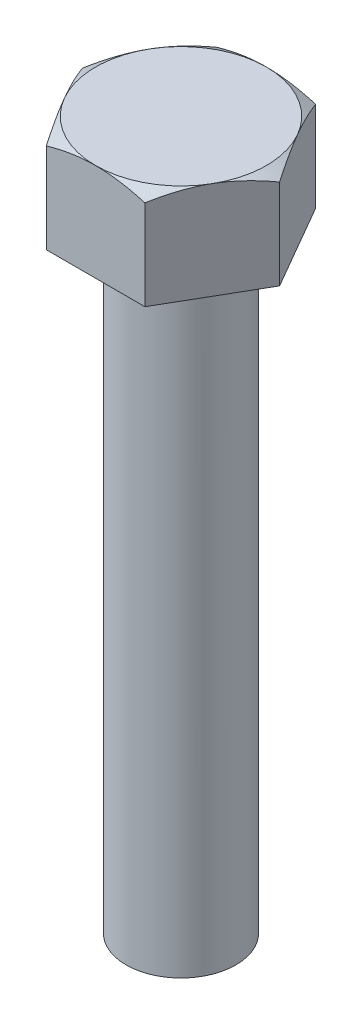
ISO-10303-21;
HEADER;
FILE_DESCRIPTION(('STEP AP214'),'2;1');
FILE_NAME('part.step','',(''),(''),'','','');
FILE_SCHEMA(('AUTOMOTIVE_DESIGN { 1 0 10303 214 1 1 1 1 }'));
ENDSEC;
DATA;
#1=APPLICATION_CONTEXT('core data for automotive mechanical design processes');
#2=APPLICATION_PROTOCOL_DEFINITION('international standard','automotive_design',2000,#1);
#3=PRODUCT_CONTEXT('',#1,'mechanical');
#4=PRODUCT('Part','Part','',(#3));
#5=PRODUCT_RELATED_PRODUCT_CATEGORY('part','',(#4));
#6=PRODUCT_DEFINITION_FORMATION('','',#4);
#7=PRODUCT_DEFINITION_CONTEXT('part definition',#1,'design');
#8=PRODUCT_DEFINITION('design','',#6,#7);
#9=PRODUCT_DEFINITION_SHAPE('','',#8);
#10=(LENGTH_UNIT() NAMED_UNIT(*) SI_UNIT(.MILLI.,.METRE.));
#11=(NAMED_UNIT(*) PLANE_ANGLE_UNIT() SI_UNIT($,.RADIAN.));
#12=(NAMED_UNIT(*) SI_UNIT($,.STERADIAN.) SOLID_ANGLE_UNIT());
#13=UNCERTAINTY_MEASURE_WITH_UNIT(LENGTH_MEASURE(1.E-05),#10,'distance_accuracy_value','');
#14=(GEOMETRIC_REPRESENTATION_CONTEXT(3) GLOBAL_UNCERTAINTY_ASSIGNED_CONTEXT((#13)) GLOBAL_UNIT_ASSIGNED_CONTEXT((#10,
#11,#12)) REPRESENTATION_CONTEXT('',''));
#15=CARTESIAN_POINT('',(0.,0.,0.));
#16=DIRECTION('',(0.,0.,1.));
#17=DIRECTION('',(1.,0.,0.));
#18=AXIS2_PLACEMENT_3D('',#15,#16,#17);
#19=CARTESIAN_POINT('',(2.02072594216373,-4.,3.49999999999998));
#20=DIRECTION('',(0.866025403784441,0.,0.499999999999995));
#21=DIRECTION('',(0.499999999999995,0.,-0.866025403784442));
#22=AXIS2_PLACEMENT_3D('',#19,#20,#21);
#23=PLANE('',#22);
#24=DIRECTION('',(0.,1.,0.));
#25=VECTOR('',#24,1.);
#26=CARTESIAN_POINT('',(4.04145188432738,-4.,0.));
#27=LINE('',#26,#25);
#28=CARTESIAN_POINT('',(4.04145188432738,-4.,0.));
#29=VERTEX_POINT('',#28);
#30=CARTESIAN_POINT('',(4.04145188432738,-0.312607391169643,0.));
#31=VERTEX_POINT('',#30);
#32=EDGE_CURVE('E142',#29,#31,#27,.T.);
#33=ORIENTED_EDGE('',*,*,#32,.T.);
#34=CARTESIAN_POINT('',(4.04156735438122,-0.312674060693368,-0.00020000000000009));
#35=CARTESIAN_POINT('',(3.9527667384984,-0.261385788989982,0.15360717845245));
#36=CARTESIAN_POINT('',(3.86319960126198,-0.214740953816197,0.308742010834425));
#37=CARTESIAN_POINT('',(3.68251437287563,-0.133321875533351,0.621698006576784));
#38=CARTESIAN_POINT('',(3.59139307116726,-0.0985764355845646,0.779524730787499));
#39=CARTESIAN_POINT('',(3.41027974688035,-0.0444900271828409,1.09322221038013));
#40=CARTESIAN_POINT('',(3.32031559103709,-0.024789086260387,1.2490446991607));
#41=CARTESIAN_POINT('',(3.13996396008053,-0.00127013273726128,1.56142288720538));
#42=CARTESIAN_POINT('',(3.04957714051107,0.00256735545442698,1.71797745103424));
#43=CARTESIAN_POINT('',(2.88068384499779,-0.00541530187698655,2.01050921992099));
#44=CARTESIAN_POINT('',(2.80215208834116,-0.015275434069616,2.14653021245791));
#45=CARTESIAN_POINT('',(2.64560020969756,-0.0465264668994118,2.41768602028899));
#46=CARTESIAN_POINT('',(2.56758062920652,-0.0679280432858057,2.55281989768468));
#47=CARTESIAN_POINT('',(2.41070596159681,-0.121430407880583,2.82453479240517));
#48=CARTESIAN_POINT('',(2.33187072981467,-0.153757994445091,2.96108141927832));
#49=CARTESIAN_POINT('',(2.17537608630787,-0.227128933807996,3.23213809294449));
#50=CARTESIAN_POINT('',(2.09771466960102,-0.268155046569867,3.36665161246852));
#51=CARTESIAN_POINT('',(2.02061047210989,-0.312674060693369,3.50019999999998));
#52=B_SPLINE_CURVE_WITH_KNOTS('',3,(#34,#35,#36,#37,#38,#39,#40,#41,#42,#43,#44,#45,#46,#47,#48,
#49,#50,#51),.UNSPECIFIED.,.F.,.F.,(4,2,2,2,2,2,2,2,4),(0.,0.554793832886253,1.11092123814984,
1.65328467083219,2.19498204478403,2.66665130850859,3.13875761298265,3.62133612600506,
4.10296698719183),.UNSPECIFIED.);
#53=CARTESIAN_POINT('',(3.03108891324554,0.,1.74999999999998));
#54=VERTEX_POINT('',#53);
#55=EDGE_CURVE('E55',#31,#54,#52,.T.);
#56=ORIENTED_EDGE('',*,*,#55,.T.);
#57=CARTESIAN_POINT('',(2.02072594216373,-0.312607391169642,3.49999999999998));
#58=VERTEX_POINT('',#57);
#59=EDGE_CURVE('E169',#54,#58,#52,.T.);
#60=ORIENTED_EDGE('',*,*,#59,.T.);
#61=DIRECTION('',(0.,1.,0.));
#62=VECTOR('',#61,1.);
#63=CARTESIAN_POINT('',(2.02072594216373,-4.,3.49999999999998));
#64=LINE('',#63,#62);
#65=CARTESIAN_POINT('',(2.02072594216373,-4.,3.49999999999998));
#66=VERTEX_POINT('',#65);
#67=EDGE_CURVE('E133',#66,#58,#64,.T.);
#68=ORIENTED_EDGE('',*,*,#67,.F.);
#69=DIRECTION('',(0.499999999999995,0.,-0.866025403784441));
#70=VECTOR('',#69,1.);
#71=CARTESIAN_POINT('',(2.02072594216373,-4.,3.49999999999998));
#72=LINE('',#71,#70);
#73=EDGE_CURVE('E166',#66,#29,#72,.T.);
#74=ORIENTED_EDGE('',*,*,#73,.T.);
#75=EDGE_LOOP('',(#33,#56,#60,#68,#74));
#76=FACE_BOUND('',#75,.T.);
#77=ADVANCED_FACE('F33',(#76),#23,.T.);
#78=CARTESIAN_POINT('',(-2.02072594216366,-4.,3.50000000000002));
#79=DIRECTION('',(0.,0.,1.));
#80=DIRECTION('',(1.,0.,0.));
#81=AXIS2_PLACEMENT_3D('',#78,#79,#80);
#82=PLANE('',#81);
#83=ORIENTED_EDGE('',*,*,#67,.T.);
#84=CARTESIAN_POINT('',(-5.35926424048619,-1.6748440724779,3.50000000000006));
#85=CARTESIAN_POINT('',(-5.20559440559572,-1.60058231497446,3.50000000000006));
#86=CARTESIAN_POINT('',(-5.05156124454355,-1.52705878056118,3.50000000000005));
#87=CARTESIAN_POINT('',(-4.74257181977879,-1.38191000416732,3.50000000000005));
#88=CARTESIAN_POINT('',(-4.58761540185543,-1.31028509085496,3.50000000000005));
#89=CARTESIAN_POINT('',(-4.27574595068721,-1.16897807882458,3.50000000000004));
#90=CARTESIAN_POINT('',(-4.11882679505205,-1.09930944363486,3.50000000000004));
#91=CARTESIAN_POINT('',(-3.80369874616061,-0.962964609282971,3.50000000000004));
#92=CARTESIAN_POINT('',(-3.64548992064161,-0.89628825413883,3.50000000000004));
#93=CARTESIAN_POINT('',(-3.3255668679968,-0.76593209090634,3.50000000000004));
#94=CARTESIAN_POINT('',(-3.1638334509989,-0.702299120726497,3.50000000000003));
#95=CARTESIAN_POINT('',(-2.83845895714225,-0.580016900953805,3.50000000000003));
#96=CARTESIAN_POINT('',(-2.67481767033953,-0.521368205835811,3.50000000000003));
#97=CARTESIAN_POINT('',(-2.345703193734,-0.410630410873415,3.50000000000002));
#98=CARTESIAN_POINT('',(-2.18023474470134,-0.358527365355124,3.50000000000002));
#99=CARTESIAN_POINT('',(-1.84694549539018,-0.262573008307886,3.50000000000002));
#100=CARTESIAN_POINT('',(-1.67912545711471,-0.218719087285585,3.50000000000002));
#101=CARTESIAN_POINT('',(-1.34101838256743,-0.141391963972234,3.50000000000001));
#102=CARTESIAN_POINT('',(-1.17073070168116,-0.107921527224786,3.50000000000001));
#103=CARTESIAN_POINT('',(-0.828102254748845,-0.0536149371423592,3.50000000000001));
#104=CARTESIAN_POINT('',(-0.655761486889094,-0.0327787949694612,3.50000000000001));
#105=CARTESIAN_POINT('',(-0.311020130690008,-0.00558406591599681,3.5));
#106=CARTESIAN_POINT('',(-0.13862696061019,0.000866175296536139,3.5));
#107=CARTESIAN_POINT('',(0.206038662929289,-0.0010535759051767,3.5));
#108=CARTESIAN_POINT('',(0.378311136109308,-0.00941972129227985,3.5));
#109=CARTESIAN_POINT('',(0.672491314888679,-0.0357689751623791,3.49999999999999));
#110=CARTESIAN_POINT('',(0.794723571901849,-0.0503207336432905,3.49999999999999));
#111=CARTESIAN_POINT('',(1.0382438777124,-0.0859368690658899,3.49999999999999));
#112=CARTESIAN_POINT('',(1.15953177450315,-0.107002273117117,3.49999999999999));
#113=CARTESIAN_POINT('',(1.52188005346719,-0.178863395249661,3.49999999999998));
#114=CARTESIAN_POINT('',(1.7612419874188,-0.238305520994606,3.49999999999998));
#115=CARTESIAN_POINT('',(2.11941071826362,-0.340827114809809,3.49999999999998));
#116=CARTESIAN_POINT('',(2.24008446757478,-0.377750017969919,3.49999999999998));
#117=CARTESIAN_POINT('',(2.48017245637081,-0.455249363005883,3.49999999999997));
#118=CARTESIAN_POINT('',(2.5995875019874,-0.495823284914268,3.49999999999997));
#119=CARTESIAN_POINT('',(2.83665872785763,-0.57978039521915,3.49999999999997));
#120=CARTESIAN_POINT('',(2.95432102488646,-0.623146485712766,3.49999999999997));
#121=CARTESIAN_POINT('',(3.18873271700622,-0.712424019210119,3.49999999999997));
#122=CARTESIAN_POINT('',(3.3054817210672,-0.758336490959498,3.49999999999997));
#123=CARTESIAN_POINT('',(3.42180858719343,-0.805270873556988,3.49999999999996));
#124=B_SPLINE_CURVE_WITH_KNOTS('',3,(#84,#85,#86,#87,#88,#89,#90,#91,#92,#93,#94,#95,#96,#97,
#98,#99,#100,#101,#102,#103,#104,#105,#106,#107,#108,#109,#110,#111,#112,#113,#114,#115,#116,
#117,#118,#119,#120,#121,#122,#123),.UNSPECIFIED.,.F.,.F.,(4,2,2,2,2,2,2,2,2,2,2,2,2,2,2,2,2,2,
2,4),(0.,0.512025467708521,1.02413900028468,1.53918315265711,2.05420042547923,2.57554051253682,
3.09693852027603,3.61720612610814,4.13730887487718,4.65755002944064,5.17779164362336,
5.69470915048346,6.21149246105176,6.58059842964299,6.94976263071819,7.6886404599271,
8.06719870082304,8.44549763256366,8.82166724342673,9.19798995093339),.UNSPECIFIED.);
#125=CARTESIAN_POINT('',(0.,0.,3.5));
#126=VERTEX_POINT('',#125);
#127=EDGE_CURVE('E176',#58,#126,#124,.F.);
#128=ORIENTED_EDGE('',*,*,#127,.T.);
#129=CARTESIAN_POINT('',(-2.02072594216366,-0.312607391169643,3.50000000000002));
#130=VERTEX_POINT('',#129);
#131=EDGE_CURVE('E177',#126,#130,#124,.F.);
#132=ORIENTED_EDGE('',*,*,#131,.T.);
#133=DIRECTION('',(0.,1.,0.));
#134=VECTOR('',#133,1.);
#135=CARTESIAN_POINT('',(-2.02072594216366,-4.,3.50000000000002));
#136=LINE('',#135,#134);
#137=CARTESIAN_POINT('',(-2.02072594216366,-4.,3.50000000000002));
#138=VERTEX_POINT('',#137);
#139=EDGE_CURVE('E130',#138,#130,#136,.T.);
#140=ORIENTED_EDGE('',*,*,#139,.F.);
#141=DIRECTION('',(1.,0.,0.));
#142=VECTOR('',#141,1.);
#143=CARTESIAN_POINT('',(-2.02072594216366,-4.,3.50000000000002));
#144=LINE('',#143,#142);
#145=EDGE_CURVE('E144',#138,#66,#144,.T.);
#146=ORIENTED_EDGE('',*,*,#145,.T.);
#147=EDGE_LOOP('',(#83,#128,#132,#140,#146));
#148=FACE_BOUND('',#147,.T.);
#149=ADVANCED_FACE('F221',(#148),#82,.T.);
#150=CARTESIAN_POINT('',(-4.04145188432738,-4.,0.));
#151=DIRECTION('',(-0.866025403784435,0.,0.500000000000007));
#152=DIRECTION('',(0.500000000000007,0.,0.866025403784435));
#153=AXIS2_PLACEMENT_3D('',#150,#151,#152);
#154=PLANE('',#153);
#155=ORIENTED_EDGE('',*,*,#139,.T.);
#156=CARTESIAN_POINT('',(-2.02061047210982,-0.31267406069337,3.50020000000002));
#157=CARTESIAN_POINT('',(-2.10941108799264,-0.261385788989983,3.34639282154757));
#158=CARTESIAN_POINT('',(-2.19897822522906,-0.214740953816197,3.1912579891656));
#159=CARTESIAN_POINT('',(-2.37966345361542,-0.13332187553335,2.87830199342324));
#160=CARTESIAN_POINT('',(-2.4707847553238,-0.0985764355845626,2.72047526921253));
#161=CARTESIAN_POINT('',(-2.65189807961071,-0.0444900271828376,2.4067777896199));
#162=CARTESIAN_POINT('',(-2.74186223545397,-0.0247890862603831,2.25095530083934));
#163=CARTESIAN_POINT('',(-2.92221386641054,-0.00127013273725584,1.93857711279465));
#164=CARTESIAN_POINT('',(-3.01260068597999,0.00256735545443344,1.7820225489658));
#165=CARTESIAN_POINT('',(-3.18149398149328,-0.00541530187697886,1.48949078007904));
#166=CARTESIAN_POINT('',(-3.26002573814991,-0.0152754340696084,1.35346978754212));
#167=CARTESIAN_POINT('',(-3.41657761679353,-0.0465264668994046,1.08231397971104));
#168=CARTESIAN_POINT('',(-3.49459719728457,-0.067928043285799,0.947180102315347));
#169=CARTESIAN_POINT('',(-3.65147186489428,-0.121430407880578,0.675465207594846));
#170=CARTESIAN_POINT('',(-3.73030709667643,-0.153757994445087,0.538918580721694));
#171=CARTESIAN_POINT('',(-3.88680174018324,-0.227128933807994,0.267861907055527));
#172=CARTESIAN_POINT('',(-3.96446315689009,-0.268155046569867,0.133348387531492));
#173=CARTESIAN_POINT('',(-4.04156735438122,-0.312674060693371,-0.000199999999971952));
#174=B_SPLINE_CURVE_WITH_KNOTS('',3,(#156,#157,#158,#159,#160,#161,#162,#163,#164,#165,#166,
#167,#168,#169,#170,#171,#172,#173),.UNSPECIFIED.,.F.,.F.,(4,2,2,2,2,2,2,2,4),(0.,
0.554793832886254,1.11092123814984,1.65328467083219,2.19498204478403,2.6666513085086,
3.13875761298268,3.6213361260051,4.10296698719188),.UNSPECIFIED.);
#175=CARTESIAN_POINT('',(-3.03108891324552,0.,1.75000000000003));
#176=VERTEX_POINT('',#175);
#177=EDGE_CURVE('E124',#130,#176,#174,.T.);
#178=ORIENTED_EDGE('',*,*,#177,.T.);
#179=CARTESIAN_POINT('',(-4.04145188432738,-0.312607391169643,0.));
#180=VERTEX_POINT('',#179);
#181=EDGE_CURVE('E107',#176,#180,#174,.T.);
#182=ORIENTED_EDGE('',*,*,#181,.T.);
#183=DIRECTION('',(0.,1.,0.));
#184=VECTOR('',#183,1.);
#185=CARTESIAN_POINT('',(-4.04145188432738,-4.,0.));
#186=LINE('',#185,#184);
#187=CARTESIAN_POINT('',(-4.04145188432738,-4.,0.));
#188=VERTEX_POINT('',#187);
#189=EDGE_CURVE('E122',#188,#180,#186,.T.);
#190=ORIENTED_EDGE('',*,*,#189,.F.);
#191=DIRECTION('',(0.500000000000007,0.,0.866025403784435));
#192=VECTOR('',#191,1.);
#193=CARTESIAN_POINT('',(-4.04145188432738,-4.,0.));
#194=LINE('',#193,#192);
#195=EDGE_CURVE('E157',#188,#138,#194,.T.);
#196=ORIENTED_EDGE('',*,*,#195,.T.);
#197=EDGE_LOOP('',(#155,#178,#182,#190,#196));
#198=FACE_BOUND('',#197,.T.);
#199=ADVANCED_FACE('F120',(#198),#154,.T.);
#200=CARTESIAN_POINT('',(-2.02072594216371,-4.,-3.49999999999999));
#201=DIRECTION('',(-0.866025403784441,0.,-0.499999999999995));
#202=DIRECTION('',(-0.499999999999995,0.,0.866025403784442));
#203=AXIS2_PLACEMENT_3D('',#200,#201,#202);
#204=PLANE('',#203);
#205=ORIENTED_EDGE('',*,*,#189,.T.);
#206=CARTESIAN_POINT('',(-4.04156735438122,-0.312674060693371,0.000200000000028311));
#207=CARTESIAN_POINT('',(-3.9527667384984,-0.261385788989984,-0.153607178452422));
#208=CARTESIAN_POINT('',(-3.86319960126198,-0.214740953816198,-0.308742010834397));
#209=CARTESIAN_POINT('',(-3.68251437287563,-0.13332187553335,-0.621698006576755));
#210=CARTESIAN_POINT('',(-3.59139307116726,-0.0985764355845631,-0.77952473078747));
#211=CARTESIAN_POINT('',(-3.41027974688035,-0.044490027182838,-1.0932222103801));
#212=CARTESIAN_POINT('',(-3.32031559103709,-0.0247890862603836,-1.24904469916067));
#213=CARTESIAN_POINT('',(-3.13996396008053,-0.00127013273725632,-1.56142288720535));
#214=CARTESIAN_POINT('',(-3.04957714051107,0.00256735545443312,-1.71797745103421));
#215=CARTESIAN_POINT('',(-2.88068384499779,-0.00541530187697885,-2.01050921992097));
#216=CARTESIAN_POINT('',(-2.80215208834116,-0.0152754340696082,-2.14653021245789));
#217=CARTESIAN_POINT('',(-2.64560020969755,-0.0465264668994043,-2.41768602028898));
#218=CARTESIAN_POINT('',(-2.56758062920651,-0.0679280432857987,-2.55281989768467));
#219=CARTESIAN_POINT('',(-2.4107059615968,-0.121430407880577,-2.82453479240517));
#220=CARTESIAN_POINT('',(-2.33187072981465,-0.153757994445087,-2.96108141927832));
#221=CARTESIAN_POINT('',(-2.17537608630785,-0.227128933807994,-3.23213809294449));
#222=CARTESIAN_POINT('',(-2.097714669601,-0.268155046569866,-3.36665161246853));
#223=CARTESIAN_POINT('',(-2.02061047210987,-0.31267406069337,-3.50019999999999));
#224=B_SPLINE_CURVE_WITH_KNOTS('',3,(#206,#207,#208,#209,#210,#211,#212,#213,#214,#215,#216,
#217,#218,#219,#220,#221,#222,#223),.UNSPECIFIED.,.F.,.F.,(4,2,2,2,2,2,2,2,4),(0.,
0.554793832886253,1.11092123814984,1.65328467083219,2.19498204478403,2.6666513085086,
3.13875761298268,3.6213361260051,4.10296698719188),.UNSPECIFIED.);
#225=CARTESIAN_POINT('',(-3.03108891324555,0.,-1.74999999999998));
#226=VERTEX_POINT('',#225);
#227=EDGE_CURVE('E104',#180,#226,#224,.T.);
#228=ORIENTED_EDGE('',*,*,#227,.T.);
#229=CARTESIAN_POINT('',(-2.02072594216371,-0.312607391169643,-3.49999999999999));
#230=VERTEX_POINT('',#229);
#231=EDGE_CURVE('E115',#226,#230,#224,.T.);
#232=ORIENTED_EDGE('',*,*,#231,.T.);
#233=DIRECTION('',(0.,1.,0.));
#234=VECTOR('',#233,1.);
#235=CARTESIAN_POINT('',(-2.02072594216371,-4.,-3.49999999999999));
#236=LINE('',#235,#234);
#237=CARTESIAN_POINT('',(-2.02072594216371,-4.,-3.49999999999999));
#238=VERTEX_POINT('',#237);
#239=EDGE_CURVE('E131',#238,#230,#236,.T.);
#240=ORIENTED_EDGE('',*,*,#239,.F.);
#241=DIRECTION('',(-0.499999999999995,0.,0.866025403784441));
#242=VECTOR('',#241,1.);
#243=CARTESIAN_POINT('',(-2.02072594216371,-4.,-3.49999999999999));
#244=LINE('',#243,#242);
#245=EDGE_CURVE('E129',#238,#188,#244,.T.);
#246=ORIENTED_EDGE('',*,*,#245,.T.);
#247=EDGE_LOOP('',(#205,#228,#232,#240,#246));
#248=FACE_BOUND('',#247,.T.);
#249=ADVANCED_FACE('F127',(#248),#204,.T.);
#250=CARTESIAN_POINT('',(2.02072594216368,-4.,-3.50000000000001));
#251=DIRECTION('',(0.,0.,-1.));
#252=DIRECTION('',(-1.,0.,0.));
#253=AXIS2_PLACEMENT_3D('',#250,#251,#252);
#254=PLANE('',#253);
#255=ORIENTED_EDGE('',*,*,#239,.T.);
#256=CARTESIAN_POINT('',(-5.35926299121407,-1.67484346858554,-3.49999999999998));
#257=CARTESIAN_POINT('',(-5.20559319908843,-1.60058173692102,-3.49999999999998));
#258=CARTESIAN_POINT('',(-5.05156008083376,-1.52705822833146,-3.49999999999998));
#259=CARTESIAN_POINT('',(-4.74257074180712,-1.3819095034475,-3.49999999999998));
#260=CARTESIAN_POINT('',(-4.58761436682438,-1.31028461582131,-3.49999999999998));
#261=CARTESIAN_POINT('',(-4.27574500225543,-1.16897765517622,-3.49999999999998));
#262=CARTESIAN_POINT('',(-4.11882589028193,-1.09930904568015,-3.49999999999999));
#263=CARTESIAN_POINT('',(-3.80369792903856,-0.962964262242749,-3.49999999999999));
#264=CARTESIAN_POINT('',(-3.64548914750596,-0.896287932319508,-3.49999999999999));
#265=CARTESIAN_POINT('',(-3.32556618401856,-0.765931819095058,-3.49999999999999));
#266=CARTESIAN_POINT('',(-3.16383281219925,-0.702298873688857,-3.49999999999999));
#267=CARTESIAN_POINT('',(-2.83845840945598,-0.580016702089486,-3.49999999999999));
#268=CARTESIAN_POINT('',(-2.67481716858827,-0.521368030370686,-3.49999999999999));
#269=CARTESIAN_POINT('',(-2.34570278472051,-0.410630279877018,-3.49999999999999));
#270=CARTESIAN_POINT('',(-2.18023438248744,-0.358527255435854,-3.49999999999999));
#271=CARTESIAN_POINT('',(-1.84694522806371,-0.262572936976441,-3.49999999999999));
#272=CARTESIAN_POINT('',(-1.67912523787532,-0.218719033467157,-3.49999999999999));
#273=CARTESIAN_POINT('',(-1.34101828610926,-0.141391945584787,-3.5));
#274=CARTESIAN_POINT('',(-1.17073068027695,-0.107921525211973,-3.5));
#275=CARTESIAN_POINT('',(-0.8281023851385,-0.0536149564320513,-3.5));
#276=CARTESIAN_POINT('',(-0.655761694017317,-0.0327788191952375,-3.5));
#277=CARTESIAN_POINT('',(-0.311020490924466,-0.00558408650575781,-3.5));
#278=CARTESIAN_POINT('',(-0.138627397207276,0.000866163165910078,-3.5));
#279=CARTESIAN_POINT('',(0.206038074906518,-0.00105355807794701,-3.5));
#280=CARTESIAN_POINT('',(0.378310473023163,-0.00941968196343245,-3.5));
#281=CARTESIAN_POINT('',(0.672490555822312,-0.0357688927868921,-3.5));
#282=CARTESIAN_POINT('',(0.794722791084079,-0.0503206340384214,-3.5));
#283=CARTESIAN_POINT('',(1.03824305430559,-0.0859367340533559,-3.5));
#284=CARTESIAN_POINT('',(1.15953093025886,-0.107002119926141,-3.5));
#285=CARTESIAN_POINT('',(1.52187914771348,-0.178863187081453,-3.50000000000001));
#286=CARTESIAN_POINT('',(1.76124104212632,-0.238305275622011,-3.50000000000001));
#287=CARTESIAN_POINT('',(2.11940971387709,-0.340826814402556,-3.50000000000001));
#288=CARTESIAN_POINT('',(2.24008344316348,-0.377749699085185,-3.50000000000001));
#289=CARTESIAN_POINT('',(2.4801713921373,-0.455249007699296,-3.50000000000001));
#290=CARTESIAN_POINT('',(2.59958641795615,-0.495822911663553,-3.50000000000001));
#291=CARTESIAN_POINT('',(2.836657604518,-0.579779986782756,-3.50000000000001));
#292=CARTESIAN_POINT('',(2.95431988203486,-0.623146060034319,-3.50000000000001));
#293=CARTESIAN_POINT('',(3.18873153508803,-0.712423559566871,-3.50000000000001));
#294=CARTESIAN_POINT('',(3.30548051959467,-0.758336014592956,-3.50000000000001));
#295=CARTESIAN_POINT('',(3.42180736613352,-0.805270380724076,-3.50000000000001));
#296=B_SPLINE_CURVE_WITH_KNOTS('',3,(#256,#257,#258,#259,#260,#261,#262,#263,#264,#265,#266,
#267,#268,#269,#270,#271,#272,#273,#274,#275,#276,#277,#278,#279,#280,#281,#282,#283,#284,#285,
#286,#287,#288,#289,#290,#291,#292,#293,#294,#295),.UNSPECIFIED.,.F.,.F.,(4,2,2,2,2,2,2,2,2,2,2,
2,2,2,2,2,2,2,2,4),(0.,0.512025318465737,1.02413870177436,1.53918270315241,2.05419982499223,
2.57553975872798,3.09693761309352,3.617205066104,4.13730766217536,4.65754858684364,
5.1777899714696,5.69470725122281,6.21149033452399,6.58059623222331,6.94976036239485,
7.68863804939852,8.0671962166048,8.44549507476763,8.82166461280102,9.19798724733414),.UNSPECIFIED.);
#297=CARTESIAN_POINT('',(0.,0.,-3.5));
#298=VERTEX_POINT('',#297);
#299=EDGE_CURVE('E253',#230,#298,#296,.T.);
#300=ORIENTED_EDGE('',*,*,#299,.T.);
#301=CARTESIAN_POINT('',(2.02072594216369,-0.312607391169642,-3.50000000000001));
#302=VERTEX_POINT('',#301);
#303=EDGE_CURVE('E205',#298,#302,#296,.T.);
#304=ORIENTED_EDGE('',*,*,#303,.T.);
#305=DIRECTION('',(0.,1.,0.));
#306=VECTOR('',#305,1.);
#307=CARTESIAN_POINT('',(2.02072594216368,-4.,-3.50000000000001));
#308=LINE('',#307,#306);
#309=CARTESIAN_POINT('',(2.02072594216368,-4.,-3.50000000000001));
#310=VERTEX_POINT('',#309);
#311=EDGE_CURVE('E136',#310,#302,#308,.T.);
#312=ORIENTED_EDGE('',*,*,#311,.F.);
#313=DIRECTION('',(-1.,0.,0.));
#314=VECTOR('',#313,1.);
#315=CARTESIAN_POINT('',(2.02072594216368,-4.,-3.50000000000001));
#316=LINE('',#315,#314);
#317=EDGE_CURVE('E160',#310,#238,#316,.T.);
#318=ORIENTED_EDGE('',*,*,#317,.T.);
#319=EDGE_LOOP('',(#255,#300,#304,#312,#318));
#320=FACE_BOUND('',#319,.T.);
#321=ADVANCED_FACE('F225',(#320),#254,.T.);
#322=CARTESIAN_POINT('',(4.04145188432738,-4.,0.));
#323=DIRECTION('',(0.866025403784438,0.,-0.500000000000001));
#324=DIRECTION('',(-0.500000000000001,0.,-0.866025403784438));
#325=AXIS2_PLACEMENT_3D('',#322,#323,#324);
#326=PLANE('',#325);
#327=ORIENTED_EDGE('',*,*,#311,.T.);
#328=CARTESIAN_POINT('',(2.02061047210985,-0.312674060693369,-3.50020000000001));
#329=CARTESIAN_POINT('',(2.10941108799266,-0.261385788989982,-3.34639282154756));
#330=CARTESIAN_POINT('',(2.19897822522908,-0.214740953816196,-3.19125798916558));
#331=CARTESIAN_POINT('',(2.37966345361544,-0.133321875533349,-2.87830199342323));
#332=CARTESIAN_POINT('',(2.47078475532382,-0.0985764355845617,-2.72047526921251));
#333=CARTESIAN_POINT('',(2.65189807961073,-0.0444900271828364,-2.40677778961988));
#334=CARTESIAN_POINT('',(2.74186223545399,-0.0247890862603817,-2.25095530083932));
#335=CARTESIAN_POINT('',(2.92221386641055,-0.00127013273725426,-1.93857711279464));
#336=CARTESIAN_POINT('',(3.01260068598001,0.00256735545443495,-1.78202254896578));
#337=CARTESIAN_POINT('',(3.18149398149329,-0.00541530187697722,-1.48949078007902));
#338=CARTESIAN_POINT('',(3.26002573814992,-0.0152754340696066,-1.3534697875421));
#339=CARTESIAN_POINT('',(3.41657761679353,-0.0465264668994026,-1.08231397971101));
#340=CARTESIAN_POINT('',(3.49459719728457,-0.0679280432857969,-0.947180102315323));
#341=CARTESIAN_POINT('',(3.65147186489429,-0.121430407880575,-0.67546520759482));
#342=CARTESIAN_POINT('',(3.73030709667644,-0.153757994445085,-0.538918580721668));
#343=CARTESIAN_POINT('',(3.88680174018324,-0.227128933807992,-0.2678619070555));
#344=CARTESIAN_POINT('',(3.96446315689009,-0.268155046569865,-0.133348387531464));
#345=CARTESIAN_POINT('',(4.04156735438122,-0.312674060693368,0.000200000000000105));
#346=B_SPLINE_CURVE_WITH_KNOTS('',3,(#328,#329,#330,#331,#332,#333,#334,#335,#336,#337,#338,
#339,#340,#341,#342,#343,#344,#345),.UNSPECIFIED.,.F.,.F.,(4,2,2,2,2,2,2,2,4),(0.,
0.554793832886253,1.11092123814984,1.65328467083219,2.19498204478403,2.6666513085086,
3.13875761298268,3.6213361260051,4.10296698719188),.UNSPECIFIED.);
#347=CARTESIAN_POINT('',(3.03108891324553,0.,-1.75));
#348=VERTEX_POINT('',#347);
#349=EDGE_CURVE('E251',#302,#348,#346,.T.);
#350=ORIENTED_EDGE('',*,*,#349,.T.);
#351=EDGE_CURVE('E197',#348,#31,#346,.T.);
#352=ORIENTED_EDGE('',*,*,#351,.T.);
#353=ORIENTED_EDGE('',*,*,#32,.F.);
#354=DIRECTION('',(-0.500000000000001,0.,-0.866025403784438));
#355=VECTOR('',#354,1.);
#356=CARTESIAN_POINT('',(4.04145188432738,-4.,0.));
#357=LINE('',#356,#355);
#358=EDGE_CURVE('E163',#29,#310,#357,.T.);
#359=ORIENTED_EDGE('',*,*,#358,.T.);
#360=EDGE_LOOP('',(#327,#350,#352,#353,#359));
#361=FACE_BOUND('',#360,.T.);
#362=ADVANCED_FACE('F228',(#361),#326,.T.);
#363=CARTESIAN_POINT('',(0.,-4.,0.));
#364=DIRECTION('',(0.,1.,0.));
#365=DIRECTION('',(0.,0.,1.));
#366=AXIS2_PLACEMENT_3D('',#363,#364,#365);
#367=PLANE('',#366);
#368=CARTESIAN_POINT('',(0.,-4.,0.));
#369=DIRECTION('',(0.,1.,0.));
#370=DIRECTION('',(0.,0.,1.));
#371=AXIS2_PLACEMENT_3D('',#368,#369,#370);
#372=CIRCLE('',#371,2.25);
#373=CARTESIAN_POINT('',(0.,-4.,2.25));
#374=VERTEX_POINT('',#373);
#375=EDGE_CURVE('E11',#374,#374,#372,.F.);
#376=ORIENTED_EDGE('',*,*,#375,.F.);
#377=EDGE_LOOP('',(#376));
#378=FACE_BOUND('',#377,.T.);
#379=ORIENTED_EDGE('',*,*,#73,.F.);
#380=ORIENTED_EDGE('',*,*,#145,.F.);
#381=ORIENTED_EDGE('',*,*,#195,.F.);
#382=ORIENTED_EDGE('',*,*,#245,.F.);
#383=ORIENTED_EDGE('',*,*,#317,.F.);
#384=ORIENTED_EDGE('',*,*,#358,.F.);
#385=EDGE_LOOP('',(#379,#380,#381,#382,#383,#384));
#386=FACE_BOUND('',#385,.T.);
#387=ADVANCED_FACE('F192',(#378,#386),#367,.F.);
#388=CARTESIAN_POINT('',(0.,0.,0.));
#389=DIRECTION('',(0.,-1.,0.));
#390=DIRECTION('',(1.,0.,0.));
#391=AXIS2_PLACEMENT_3D('',#388,#389,#390);
#392=CONICAL_SURFACE('',#391,3.5,1.0471975511966);
#393=CARTESIAN_POINT('',(0.,0.,0.));
#394=DIRECTION('',(0.,1.,0.));
#395=DIRECTION('',(-1.,0.,0.));
#396=AXIS2_PLACEMENT_3D('',#393,#394,#395);
#397=CIRCLE('',#396,3.5);
#398=EDGE_CURVE('E254',#176,#126,#397,.T.);
#399=ORIENTED_EDGE('',*,*,#398,.F.);
#400=ORIENTED_EDGE('',*,*,#177,.F.);
#401=ORIENTED_EDGE('',*,*,#131,.F.);
#402=EDGE_LOOP('',(#399,#400,#401));
#403=FACE_BOUND('',#402,.T.);
#404=ADVANCED_FACE('F236',(#403),#392,.T.);
#405=CARTESIAN_POINT('',(0.,0.,0.));
#406=DIRECTION('',(0.,1.,0.));
#407=DIRECTION('',(0.,0.,1.));
#408=AXIS2_PLACEMENT_3D('',#405,#406,#407);
#409=CIRCLE('',#408,3.5);
#410=EDGE_CURVE('E110',#226,#176,#409,.T.);
#411=ORIENTED_EDGE('',*,*,#410,.F.);
#412=ORIENTED_EDGE('',*,*,#227,.F.);
#413=ORIENTED_EDGE('',*,*,#181,.F.);
#414=EDGE_LOOP('',(#411,#412,#413));
#415=FACE_BOUND('',#414,.T.);
#416=ADVANCED_FACE('F106',(#415),#392,.T.);
#417=EDGE_CURVE('E150',#298,#226,#409,.T.);
#418=ORIENTED_EDGE('',*,*,#417,.F.);
#419=ORIENTED_EDGE('',*,*,#299,.F.);
#420=ORIENTED_EDGE('',*,*,#231,.F.);
#421=EDGE_LOOP('',(#418,#419,#420));
#422=FACE_BOUND('',#421,.T.);
#423=ADVANCED_FACE('F188',(#422),#392,.T.);
#424=EDGE_CURVE('E149',#348,#298,#409,.T.);
#425=ORIENTED_EDGE('',*,*,#424,.F.);
#426=ORIENTED_EDGE('',*,*,#349,.F.);
#427=ORIENTED_EDGE('',*,*,#303,.F.);
#428=EDGE_LOOP('',(#425,#426,#427));
#429=FACE_BOUND('',#428,.T.);
#430=ADVANCED_FACE('F182',(#429),#392,.T.);
#431=ORIENTED_EDGE('',*,*,#351,.F.);
#432=EDGE_CURVE('E145',#54,#348,#409,.T.);
#433=ORIENTED_EDGE('',*,*,#432,.F.);
#434=ORIENTED_EDGE('',*,*,#55,.F.);
#435=EDGE_LOOP('',(#431,#433,#434));
#436=FACE_BOUND('',#435,.T.);
#437=ADVANCED_FACE('F187',(#436),#392,.T.);
#438=EDGE_CURVE('E41',#126,#54,#409,.T.);
#439=ORIENTED_EDGE('',*,*,#438,.F.);
#440=ORIENTED_EDGE('',*,*,#127,.F.);
#441=ORIENTED_EDGE('',*,*,#59,.F.);
#442=EDGE_LOOP('',(#439,#440,#441));
#443=FACE_BOUND('',#442,.T.);
#444=ADVANCED_FACE('F270',(#443),#392,.T.);
#445=CARTESIAN_POINT('',(0.,0.,0.));
#446=DIRECTION('',(0.,1.,0.));
#447=DIRECTION('',(0.,0.,1.));
#448=AXIS2_PLACEMENT_3D('',#445,#446,#447);
#449=PLANE('',#448);
#450=ORIENTED_EDGE('',*,*,#398,.T.);
#451=ORIENTED_EDGE('',*,*,#438,.T.);
#452=ORIENTED_EDGE('',*,*,#432,.T.);
#453=ORIENTED_EDGE('',*,*,#424,.T.);
#454=ORIENTED_EDGE('',*,*,#417,.T.);
#455=ORIENTED_EDGE('',*,*,#410,.T.);
#456=EDGE_LOOP('',(#450,#451,#452,#453,#454,#455));
#457=FACE_BOUND('',#456,.T.);
#458=ADVANCED_FACE('F264',(#457),#449,.T.);
#459=CARTESIAN_POINT('',(0.,-29.,0.));
#460=DIRECTION('',(0.,1.,0.));
#461=DIRECTION('',(0.,0.,1.));
#462=AXIS2_PLACEMENT_3D('',#459,#460,#461);
#463=CYLINDRICAL_SURFACE('',#462,2.25);
#464=CARTESIAN_POINT('',(0.,-29.,0.));
#465=DIRECTION('',(0.,-1.,0.));
#466=DIRECTION('',(0.,0.,-1.));
#467=AXIS2_PLACEMENT_3D('',#464,#465,#466);
#468=CIRCLE('',#467,2.25);
#469=CARTESIAN_POINT('',(0.,-29.,-2.25));
#470=VERTEX_POINT('',#469);
#471=EDGE_CURVE('E255',#470,#470,#468,.T.);
#472=ORIENTED_EDGE('',*,*,#471,.F.);
#473=EDGE_LOOP('',(#472));
#474=FACE_BOUND('',#473,.T.);
#475=ORIENTED_EDGE('',*,*,#375,.T.);
#476=EDGE_LOOP('',(#475));
#477=FACE_BOUND('',#476,.T.);
#478=ADVANCED_FACE('F190',(#474,#477),#463,.T.);
#479=CARTESIAN_POINT('',(0.,-29.,0.));
#480=DIRECTION('',(0.,-1.,0.));
#481=DIRECTION('',(0.,0.,-1.));
#482=AXIS2_PLACEMENT_3D('',#479,#480,#481);
#483=PLANE('',#482);
#484=ORIENTED_EDGE('',*,*,#471,.T.);
#485=EDGE_LOOP('',(#484));
#486=FACE_BOUND('',#485,.T.);
#487=ADVANCED_FACE('F260',(#486),#483,.T.);
#488=CLOSED_SHELL('',(#77,#149,#199,#249,#321,#362,#387,#404,#416,#423,#430,#437,#444,#458,#478,#487));
#489=MANIFOLD_SOLID_BREP('B2',#488);
#490=ADVANCED_BREP_SHAPE_REPRESENTATION('',(#18,#489),#14);
#491=SHAPE_DEFINITION_REPRESENTATION(#9,#490);
ENDSEC;
END-ISO-10303-21;
